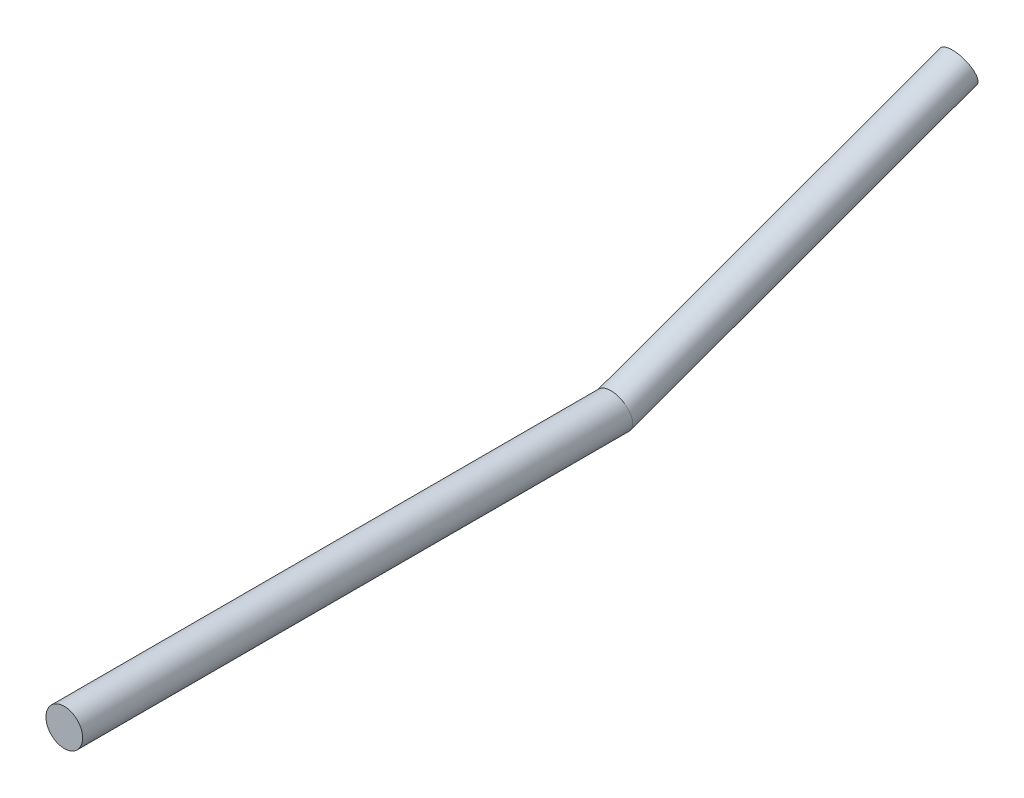
ISO-10303-21;
HEADER;
FILE_DESCRIPTION(('STEP AP214'),'2;1');
FILE_NAME('part.step','',(''),(''),'','','');
FILE_SCHEMA(('AUTOMOTIVE_DESIGN { 1 0 10303 214 1 1 1 1 }'));
ENDSEC;
DATA;
#1=APPLICATION_CONTEXT('core data for automotive mechanical design processes');
#2=APPLICATION_PROTOCOL_DEFINITION('international standard','automotive_design',2000,#1);
#3=PRODUCT_CONTEXT('',#1,'mechanical');
#4=PRODUCT('Part','Part','',(#3));
#5=PRODUCT_RELATED_PRODUCT_CATEGORY('part','',(#4));
#6=PRODUCT_DEFINITION_FORMATION('','',#4);
#7=PRODUCT_DEFINITION_CONTEXT('part definition',#1,'design');
#8=PRODUCT_DEFINITION('design','',#6,#7);
#9=PRODUCT_DEFINITION_SHAPE('','',#8);
#10=(LENGTH_UNIT() NAMED_UNIT(*) SI_UNIT(.MILLI.,.METRE.));
#11=(NAMED_UNIT(*) PLANE_ANGLE_UNIT() SI_UNIT($,.RADIAN.));
#12=(NAMED_UNIT(*) SI_UNIT($,.STERADIAN.) SOLID_ANGLE_UNIT());
#13=UNCERTAINTY_MEASURE_WITH_UNIT(LENGTH_MEASURE(1.E-05),#10,'distance_accuracy_value','');
#14=(GEOMETRIC_REPRESENTATION_CONTEXT(3) GLOBAL_UNCERTAINTY_ASSIGNED_CONTEXT((#13)) GLOBAL_UNIT_ASSIGNED_CONTEXT((#10,
#11,#12)) REPRESENTATION_CONTEXT('',''));
#15=CARTESIAN_POINT('',(0.,0.,0.));
#16=DIRECTION('',(0.,0.,1.));
#17=DIRECTION('',(1.,0.,0.));
#18=AXIS2_PLACEMENT_3D('',#15,#16,#17);
#19=CARTESIAN_POINT('',(0.,0.,37.49));
#20=DIRECTION('',(0.,0.,1.));
#21=DIRECTION('',(1.,0.,0.));
#22=AXIS2_PLACEMENT_3D('',#19,#20,#21);
#23=PLANE('',#22);
#24=CARTESIAN_POINT('',(0.,0.,37.49));
#25=DIRECTION('',(0.,0.,1.));
#26=DIRECTION('',(1.,0.,0.));
#27=AXIS2_PLACEMENT_3D('',#24,#25,#26);
#28=CIRCLE('',#27,1.25);
#29=CARTESIAN_POINT('',(1.25,0.,37.49));
#30=VERTEX_POINT('',#29);
#31=EDGE_CURVE('E40',#30,#30,#28,.T.);
#32=ORIENTED_EDGE('',*,*,#31,.T.);
#33=EDGE_LOOP('',(#32));
#34=FACE_BOUND('',#33,.T.);
#35=ADVANCED_FACE('F37',(#34),#23,.T.);
#36=CARTESIAN_POINT('',(0.,8.55050358314173,-23.4923155196477));
#37=DIRECTION('',(0.,-0.342020143325669,0.939692620785908));
#38=DIRECTION('',(1.,0.,0.));
#39=AXIS2_PLACEMENT_3D('',#36,#37,#38);
#40=PLANE('',#39);
#41=CARTESIAN_POINT('',(0.,8.55050358314173,-23.4923155196477));
#42=DIRECTION('',(0.,-0.342020143325669,0.939692620785908));
#43=DIRECTION('',(1.,0.,0.));
#44=AXIS2_PLACEMENT_3D('',#41,#42,#43);
#45=CIRCLE('',#44,1.25);
#46=CARTESIAN_POINT('',(1.25,8.55050358314173,-23.4923155196477));
#47=VERTEX_POINT('',#46);
#48=EDGE_CURVE('E44',#47,#47,#45,.T.);
#49=ORIENTED_EDGE('',*,*,#48,.F.);
#50=EDGE_LOOP('',(#49));
#51=FACE_BOUND('',#50,.T.);
#52=ADVANCED_FACE('F58',(#51),#40,.F.);
#53=CARTESIAN_POINT('',(0.,0.,-0.58489919694828));
#54=DIRECTION('',(0.,0.,1.));
#55=DIRECTION('',(1.,0.,0.));
#56=AXIS2_PLACEMENT_3D('',#53,#54,#55);
#57=CYLINDRICAL_SURFACE('',#56,1.25);
#58=CARTESIAN_POINT('',(0.,0.,0.));
#59=DIRECTION('',(0.,-0.173648177666931,0.984807753012208));
#60=DIRECTION('',(0.,-0.984807753012208,-0.173648177666931));
#61=AXIS2_PLACEMENT_3D('',#58,#59,#60);
#62=ELLIPSE('',#61,1.26928326485718,1.25);
#63=CARTESIAN_POINT('',(0.,-1.25,-0.220408725885582));
#64=VERTEX_POINT('',#63);
#65=EDGE_CURVE('E10',#64,#64,#62,.F.);
#66=ORIENTED_EDGE('',*,*,#65,.F.);
#67=EDGE_LOOP('',(#66));
#68=FACE_BOUND('',#67,.T.);
#69=ORIENTED_EDGE('',*,*,#31,.F.);
#70=EDGE_LOOP('',(#69));
#71=FACE_BOUND('',#70,.T.);
#72=ADVANCED_FACE('F55',(#68,#71),#57,.T.);
#73=CARTESIAN_POINT('',(0.,8.55050358314173,-23.4923155196477));
#74=DIRECTION('',(0.,-0.342020143325669,0.939692620785908));
#75=DIRECTION('',(0.,-0.939692620785908,-0.342020143325669));
#76=AXIS2_PLACEMENT_3D('',#73,#74,#75);
#77=CYLINDRICAL_SURFACE('',#76,1.25);
#78=ORIENTED_EDGE('',*,*,#48,.T.);
#79=EDGE_LOOP('',(#78));
#80=FACE_BOUND('',#79,.T.);
#81=ORIENTED_EDGE('',*,*,#65,.T.);
#82=EDGE_LOOP('',(#81));
#83=FACE_BOUND('',#82,.T.);
#84=ADVANCED_FACE('F57',(#80,#83),#77,.T.);
#85=CLOSED_SHELL('',(#35,#52,#72,#84));
#86=MANIFOLD_SOLID_BREP('B2',#85);
#87=ADVANCED_BREP_SHAPE_REPRESENTATION('',(#18,#86),#14);
#88=SHAPE_DEFINITION_REPRESENTATION(#9,#87);
ENDSEC;
END-ISO-10303-21;
